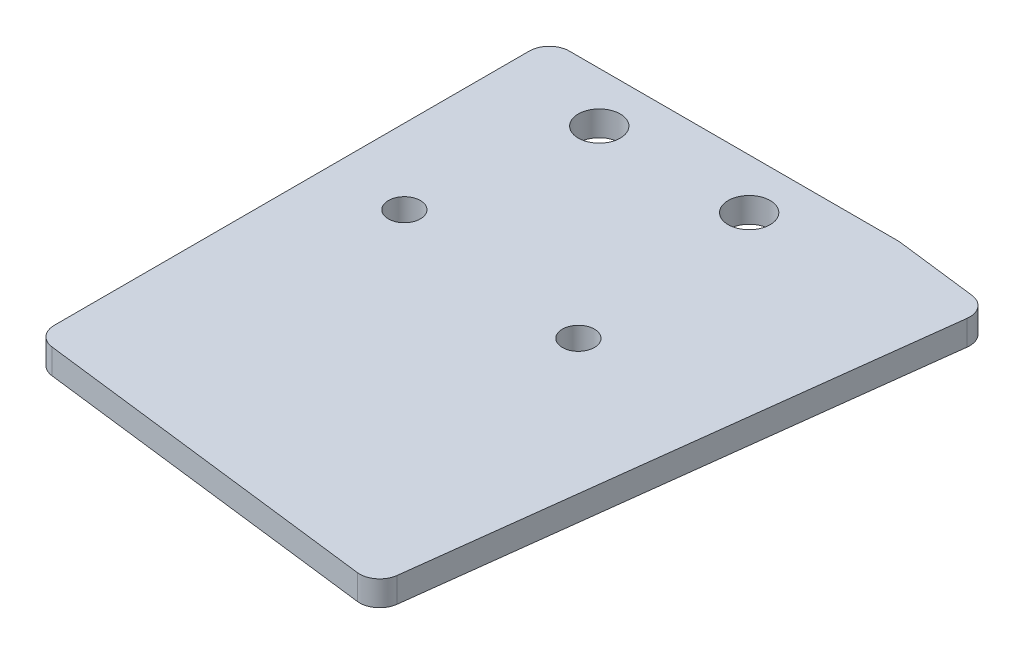
ISO-10303-21;
HEADER;
FILE_DESCRIPTION(('STEP AP214'),'2;1');
FILE_NAME('part.step','',(''),(''),'','','');
FILE_SCHEMA(('AUTOMOTIVE_DESIGN { 1 0 10303 214 1 1 1 1 }'));
ENDSEC;
DATA;
#1=APPLICATION_CONTEXT('core data for automotive mechanical design processes');
#2=APPLICATION_PROTOCOL_DEFINITION('international standard','automotive_design',2000,#1);
#3=PRODUCT_CONTEXT('',#1,'mechanical');
#4=PRODUCT('Part','Part','',(#3));
#5=PRODUCT_RELATED_PRODUCT_CATEGORY('part','',(#4));
#6=PRODUCT_DEFINITION_FORMATION('','',#4);
#7=PRODUCT_DEFINITION_CONTEXT('part definition',#1,'design');
#8=PRODUCT_DEFINITION('design','',#6,#7);
#9=PRODUCT_DEFINITION_SHAPE('','',#8);
#10=(LENGTH_UNIT() NAMED_UNIT(*) SI_UNIT(.MILLI.,.METRE.));
#11=(NAMED_UNIT(*) PLANE_ANGLE_UNIT() SI_UNIT($,.RADIAN.));
#12=(NAMED_UNIT(*) SI_UNIT($,.STERADIAN.) SOLID_ANGLE_UNIT());
#13=UNCERTAINTY_MEASURE_WITH_UNIT(LENGTH_MEASURE(1.E-05),#10,'distance_accuracy_value','');
#14=(GEOMETRIC_REPRESENTATION_CONTEXT(3) GLOBAL_UNCERTAINTY_ASSIGNED_CONTEXT((#13)) GLOBAL_UNIT_ASSIGNED_CONTEXT((#10,
#11,#12)) REPRESENTATION_CONTEXT('',''));
#15=CARTESIAN_POINT('',(0.,0.,0.));
#16=DIRECTION('',(0.,0.,1.));
#17=DIRECTION('',(1.,0.,0.));
#18=AXIS2_PLACEMENT_3D('',#15,#16,#17);
#19=CARTESIAN_POINT('',(0.,2.5,0.));
#20=DIRECTION('',(0.,1.,0.));
#21=DIRECTION('',(0.,0.,1.));
#22=AXIS2_PLACEMENT_3D('',#19,#20,#21);
#23=PLANE('',#22);
#24=CARTESIAN_POINT('',(-7.5,2.5,0.));
#25=DIRECTION('',(0.,1.,0.));
#26=DIRECTION('',(0.,0.,1.));
#27=AXIS2_PLACEMENT_3D('',#24,#25,#26);
#28=CIRCLE('',#27,2.1);
#29=CARTESIAN_POINT('',(-7.5,2.5,2.1));
#30=VERTEX_POINT('',#29);
#31=EDGE_CURVE('E147',#30,#30,#28,.T.);
#32=ORIENTED_EDGE('',*,*,#31,.F.);
#33=EDGE_LOOP('',(#32));
#34=FACE_BOUND('',#33,.T.);
#35=DIRECTION('',(-1.,0.,0.));
#36=VECTOR('',#35,1.);
#37=CARTESIAN_POINT('',(-17.5,2.5,-5.));
#38=LINE('',#37,#36);
#39=CARTESIAN_POINT('',(17.377674759699,2.5,-5.));
#40=VERTEX_POINT('',#39);
#41=CARTESIAN_POINT('',(-15.5,2.5,-5.));
#42=VERTEX_POINT('',#41);
#43=EDGE_CURVE('E142',#40,#42,#38,.T.);
#44=ORIENTED_EDGE('',*,*,#43,.T.);
#45=CARTESIAN_POINT('',(-15.5,2.5,-3.));
#46=DIRECTION('',(0.,1.,0.));
#47=DIRECTION('',(0.,0.,1.));
#48=AXIS2_PLACEMENT_3D('',#45,#46,#47);
#49=CIRCLE('',#48,2.);
#50=CARTESIAN_POINT('',(-17.5,2.5,-3.));
#51=VERTEX_POINT('',#50);
#52=EDGE_CURVE('E168',#42,#51,#49,.T.);
#53=ORIENTED_EDGE('',*,*,#52,.T.);
#54=DIRECTION('',(0.,0.,1.));
#55=VECTOR('',#54,1.);
#56=CARTESIAN_POINT('',(-17.5,2.5,-5.));
#57=LINE('',#56,#55);
#58=CARTESIAN_POINT('',(-17.5,2.5,44.5349600278818));
#59=VERTEX_POINT('',#58);
#60=EDGE_CURVE('E134',#51,#59,#57,.T.);
#61=ORIENTED_EDGE('',*,*,#60,.T.);
#62=CARTESIAN_POINT('',(-15.5,2.5,44.5349600278818));
#63=DIRECTION('',(0.,1.,0.));
#64=DIRECTION('',(0.,0.,1.));
#65=AXIS2_PLACEMENT_3D('',#62,#63,#64);
#66=CIRCLE('',#65,2.);
#67=CARTESIAN_POINT('',(-15.7437386868103,2.5,46.5200523311644));
#68=VERTEX_POINT('',#67);
#69=EDGE_CURVE('E166',#59,#68,#66,.T.);
#70=ORIENTED_EDGE('',*,*,#69,.T.);
#71=DIRECTION('',(0.992546151641323,0.,0.121869343405144));
#72=VECTOR('',#71,1.);
#73=CARTESIAN_POINT('',(17.5,2.5,50.6018701885952));
#74=LINE('',#73,#72);
#75=CARTESIAN_POINT('',(19.0979427020093,2.5,50.7980728816094));
#76=VERTEX_POINT('',#75);
#77=EDGE_CURVE('E210',#68,#76,#74,.T.);
#78=ORIENTED_EDGE('',*,*,#77,.T.);
#79=CARTESIAN_POINT('',(19.3416813888196,2.5,48.8129805783268));
#80=DIRECTION('',(0.,1.,0.));
#81=DIRECTION('',(0.,0.,1.));
#82=AXIS2_PLACEMENT_3D('',#79,#80,#81);
#83=CIRCLE('',#82,2.);
#84=CARTESIAN_POINT('',(21.3267736921022,2.5,49.0567192651371));
#85=VERTEX_POINT('',#84);
#86=EDGE_CURVE('E164',#76,#85,#83,.T.);
#87=ORIENTED_EDGE('',*,*,#86,.T.);
#88=DIRECTION('',(0.121869343405145,0.,-0.992546151641322));
#89=VECTOR('',#88,1.);
#90=CARTESIAN_POINT('',(21.0830350052919,2.5,51.0418115684197));
#91=LINE('',#90,#89);
#92=CARTESIAN_POINT('',(27.5649512359373,2.5,-1.74915973106862));
#93=VERTEX_POINT('',#92);
#94=EDGE_CURVE('E194',#85,#93,#91,.T.);
#95=ORIENTED_EDGE('',*,*,#94,.T.);
#96=CARTESIAN_POINT('',(25.5798589326546,2.5,-1.99289841787892));
#97=DIRECTION('',(0.,1.,0.));
#98=DIRECTION('',(0.,0.,1.));
#99=AXIS2_PLACEMENT_3D('',#96,#97,#98);
#100=CIRCLE('',#99,2.);
#101=CARTESIAN_POINT('',(25.8235976194649,2.5,-3.97799072116156));
#102=VERTEX_POINT('',#101);
#103=EDGE_CURVE('E57',#93,#102,#100,.T.);
#104=ORIENTED_EDGE('',*,*,#103,.T.);
#105=DIRECTION('',(-0.992546151641322,0.,-0.121869343405144));
#106=VECTOR('',#105,1.);
#107=CARTESIAN_POINT('',(27.8086899227476,2.5,-3.73425203435127));
#108=LINE('',#107,#106);
#109=CARTESIAN_POINT('',(17.6214134465093,2.5,-4.98509230328265));
#110=VERTEX_POINT('',#109);
#111=EDGE_CURVE('E183',#102,#110,#108,.T.);
#112=ORIENTED_EDGE('',*,*,#111,.T.);
#113=CARTESIAN_POINT('',(17.377674759699,2.5,-3.));
#114=DIRECTION('',(0.,1.,0.));
#115=DIRECTION('',(0.,0.,1.));
#116=AXIS2_PLACEMENT_3D('',#113,#114,#115);
#117=CIRCLE('',#116,2.);
#118=EDGE_CURVE('E162',#110,#40,#117,.T.);
#119=ORIENTED_EDGE('',*,*,#118,.T.);
#120=EDGE_LOOP('',(#44,#53,#61,#70,#78,#87,#95,#104,#112,#119));
#121=FACE_BOUND('',#120,.T.);
#122=CARTESIAN_POINT('',(7.5,2.5,0.));
#123=DIRECTION('',(0.,1.,0.));
#124=DIRECTION('',(0.,0.,1.));
#125=AXIS2_PLACEMENT_3D('',#122,#123,#124);
#126=CIRCLE('',#125,2.1);
#127=CARTESIAN_POINT('',(7.5,2.5,2.1));
#128=VERTEX_POINT('',#127);
#129=EDGE_CURVE('E219',#128,#128,#126,.T.);
#130=ORIENTED_EDGE('',*,*,#129,.F.);
#131=EDGE_LOOP('',(#130));
#132=FACE_BOUND('',#131,.T.);
#133=CARTESIAN_POINT('',(-10.,2.5,17.));
#134=DIRECTION('',(0.,1.,0.));
#135=DIRECTION('',(0.,0.,1.));
#136=AXIS2_PLACEMENT_3D('',#133,#134,#135);
#137=CIRCLE('',#136,1.6);
#138=CARTESIAN_POINT('',(-10.,2.5,18.6));
#139=VERTEX_POINT('',#138);
#140=EDGE_CURVE('E202',#139,#139,#137,.T.);
#141=ORIENTED_EDGE('',*,*,#140,.F.);
#142=EDGE_LOOP('',(#141));
#143=FACE_BOUND('',#142,.T.);
#144=CARTESIAN_POINT('',(9.85092303282645,2.5,19.4373868681029));
#145=DIRECTION('',(0.,1.,0.));
#146=DIRECTION('',(0.,0.,1.));
#147=AXIS2_PLACEMENT_3D('',#144,#145,#146);
#148=CIRCLE('',#147,1.6);
#149=CARTESIAN_POINT('',(9.85092303282645,2.5,21.0373868681029));
#150=VERTEX_POINT('',#149);
#151=EDGE_CURVE('E213',#150,#150,#148,.T.);
#152=ORIENTED_EDGE('',*,*,#151,.F.);
#153=EDGE_LOOP('',(#152));
#154=FACE_BOUND('',#153,.T.);
#155=ADVANCED_FACE('F37',(#34,#121,#132,#143,#154),#23,.T.);
#156=CARTESIAN_POINT('',(0.,0.,0.));
#157=DIRECTION('',(0.,1.,0.));
#158=DIRECTION('',(0.,0.,1.));
#159=AXIS2_PLACEMENT_3D('',#156,#157,#158);
#160=PLANE('',#159);
#161=DIRECTION('',(0.,0.,1.));
#162=VECTOR('',#161,1.);
#163=CARTESIAN_POINT('',(-17.5,0.,-5.));
#164=LINE('',#163,#162);
#165=CARTESIAN_POINT('',(-17.5,0.,-3.));
#166=VERTEX_POINT('',#165);
#167=CARTESIAN_POINT('',(-17.5,0.,44.5349600278818));
#168=VERTEX_POINT('',#167);
#169=EDGE_CURVE('E131',#166,#168,#164,.T.);
#170=ORIENTED_EDGE('',*,*,#169,.F.);
#171=CARTESIAN_POINT('',(-15.5,0.,-3.));
#172=DIRECTION('',(0.,1.,0.));
#173=DIRECTION('',(0.,0.,1.));
#174=AXIS2_PLACEMENT_3D('',#171,#172,#173);
#175=CIRCLE('',#174,2.);
#176=CARTESIAN_POINT('',(-15.5,0.,-5.));
#177=VERTEX_POINT('',#176);
#178=EDGE_CURVE('E113',#166,#177,#175,.F.);
#179=ORIENTED_EDGE('',*,*,#178,.T.);
#180=DIRECTION('',(-1.,0.,0.));
#181=VECTOR('',#180,1.);
#182=CARTESIAN_POINT('',(-17.5,0.,-5.));
#183=LINE('',#182,#181);
#184=CARTESIAN_POINT('',(17.377674759699,0.,-5.));
#185=VERTEX_POINT('',#184);
#186=EDGE_CURVE('E143',#185,#177,#183,.T.);
#187=ORIENTED_EDGE('',*,*,#186,.F.);
#188=CARTESIAN_POINT('',(17.377674759699,0.,-3.));
#189=DIRECTION('',(0.,1.,0.));
#190=DIRECTION('',(0.,0.,1.));
#191=AXIS2_PLACEMENT_3D('',#188,#189,#190);
#192=CIRCLE('',#191,2.);
#193=CARTESIAN_POINT('',(17.6214134465093,0.,-4.98509230328265));
#194=VERTEX_POINT('',#193);
#195=EDGE_CURVE('E153',#185,#194,#192,.F.);
#196=ORIENTED_EDGE('',*,*,#195,.T.);
#197=DIRECTION('',(0.992546151641323,0.,0.121869343405144));
#198=VECTOR('',#197,1.);
#199=CARTESIAN_POINT('',(27.8086899227476,0.,-3.73425203435127));
#200=LINE('',#199,#198);
#201=CARTESIAN_POINT('',(25.8235976194649,0.,-3.97799072116156));
#202=VERTEX_POINT('',#201);
#203=EDGE_CURVE('E182',#194,#202,#200,.T.);
#204=ORIENTED_EDGE('',*,*,#203,.T.);
#205=CARTESIAN_POINT('',(25.5798589326546,0.,-1.99289841787892));
#206=DIRECTION('',(0.,1.,0.));
#207=DIRECTION('',(0.,0.,1.));
#208=AXIS2_PLACEMENT_3D('',#205,#206,#207);
#209=CIRCLE('',#208,2.);
#210=CARTESIAN_POINT('',(27.5649512359373,0.,-1.74915973106864));
#211=VERTEX_POINT('',#210);
#212=EDGE_CURVE('E135',#202,#211,#209,.F.);
#213=ORIENTED_EDGE('',*,*,#212,.T.);
#214=DIRECTION('',(-0.121869343405145,0.,0.992546151641323));
#215=VECTOR('',#214,1.);
#216=CARTESIAN_POINT('',(21.0830350052919,0.,51.0418115684197));
#217=LINE('',#216,#215);
#218=CARTESIAN_POINT('',(21.3267736921022,0.,49.0567192651371));
#219=VERTEX_POINT('',#218);
#220=EDGE_CURVE('E188',#211,#219,#217,.T.);
#221=ORIENTED_EDGE('',*,*,#220,.T.);
#222=CARTESIAN_POINT('',(19.3416813888196,0.,48.8129805783268));
#223=DIRECTION('',(0.,1.,0.));
#224=DIRECTION('',(0.,0.,1.));
#225=AXIS2_PLACEMENT_3D('',#222,#223,#224);
#226=CIRCLE('',#225,2.);
#227=CARTESIAN_POINT('',(19.0979427020093,0.,50.7980728816094));
#228=VERTEX_POINT('',#227);
#229=EDGE_CURVE('E155',#219,#228,#226,.F.);
#230=ORIENTED_EDGE('',*,*,#229,.T.);
#231=DIRECTION('',(-0.992546151641323,0.,-0.121869343405144));
#232=VECTOR('',#231,1.);
#233=CARTESIAN_POINT('',(17.5,0.,50.6018701885952));
#234=LINE('',#233,#232);
#235=CARTESIAN_POINT('',(-15.7437386868103,0.,46.5200523311644));
#236=VERTEX_POINT('',#235);
#237=EDGE_CURVE('E208',#228,#236,#234,.T.);
#238=ORIENTED_EDGE('',*,*,#237,.T.);
#239=CARTESIAN_POINT('',(-15.5,0.,44.5349600278818));
#240=DIRECTION('',(0.,1.,0.));
#241=DIRECTION('',(0.,0.,1.));
#242=AXIS2_PLACEMENT_3D('',#239,#240,#241);
#243=CIRCLE('',#242,2.);
#244=EDGE_CURVE('E124',#236,#168,#243,.F.);
#245=ORIENTED_EDGE('',*,*,#244,.T.);
#246=EDGE_LOOP('',(#170,#179,#187,#196,#204,#213,#221,#230,#238,#245));
#247=FACE_BOUND('',#246,.T.);
#248=CARTESIAN_POINT('',(-7.5,0.,0.));
#249=DIRECTION('',(0.,1.,0.));
#250=DIRECTION('',(0.,0.,1.));
#251=AXIS2_PLACEMENT_3D('',#248,#249,#250);
#252=CIRCLE('',#251,2.1);
#253=CARTESIAN_POINT('',(-7.5,0.,2.1));
#254=VERTEX_POINT('',#253);
#255=EDGE_CURVE('E222',#254,#254,#252,.T.);
#256=ORIENTED_EDGE('',*,*,#255,.T.);
#257=EDGE_LOOP('',(#256));
#258=FACE_BOUND('',#257,.T.);
#259=CARTESIAN_POINT('',(7.5,0.,0.));
#260=DIRECTION('',(0.,1.,0.));
#261=DIRECTION('',(0.,0.,1.));
#262=AXIS2_PLACEMENT_3D('',#259,#260,#261);
#263=CIRCLE('',#262,2.1);
#264=CARTESIAN_POINT('',(7.5,0.,2.1));
#265=VERTEX_POINT('',#264);
#266=EDGE_CURVE('E206',#265,#265,#263,.T.);
#267=ORIENTED_EDGE('',*,*,#266,.T.);
#268=EDGE_LOOP('',(#267));
#269=FACE_BOUND('',#268,.T.);
#270=CARTESIAN_POINT('',(-10.,0.,17.));
#271=DIRECTION('',(0.,1.,0.));
#272=DIRECTION('',(0.,0.,1.));
#273=AXIS2_PLACEMENT_3D('',#270,#271,#272);
#274=CIRCLE('',#273,1.6);
#275=CARTESIAN_POINT('',(-10.,0.,18.6));
#276=VERTEX_POINT('',#275);
#277=EDGE_CURVE('E207',#276,#276,#274,.F.);
#278=ORIENTED_EDGE('',*,*,#277,.F.);
#279=EDGE_LOOP('',(#278));
#280=FACE_BOUND('',#279,.T.);
#281=CARTESIAN_POINT('',(9.85092303282645,0.,19.4373868681029));
#282=DIRECTION('',(0.,1.,0.));
#283=DIRECTION('',(0.,0.,1.));
#284=AXIS2_PLACEMENT_3D('',#281,#282,#283);
#285=CIRCLE('',#284,1.6);
#286=CARTESIAN_POINT('',(9.85092303282645,0.,21.0373868681029));
#287=VERTEX_POINT('',#286);
#288=EDGE_CURVE('E203',#287,#287,#285,.F.);
#289=ORIENTED_EDGE('',*,*,#288,.F.);
#290=EDGE_LOOP('',(#289));
#291=FACE_BOUND('',#290,.T.);
#292=ADVANCED_FACE('F138',(#247,#258,#269,#280,#291),#160,.F.);
#293=CARTESIAN_POINT('',(-17.5,2.5,-5.));
#294=DIRECTION('',(0.,0.,1.));
#295=DIRECTION('',(1.,0.,0.));
#296=AXIS2_PLACEMENT_3D('',#293,#294,#295);
#297=PLANE('',#296);
#298=ORIENTED_EDGE('',*,*,#186,.T.);
#299=DIRECTION('',(0.,-1.,0.));
#300=VECTOR('',#299,1.);
#301=CARTESIAN_POINT('',(-15.5,2.5,-5.));
#302=LINE('',#301,#300);
#303=EDGE_CURVE('E118',#177,#42,#302,.F.);
#304=ORIENTED_EDGE('',*,*,#303,.T.);
#305=ORIENTED_EDGE('',*,*,#43,.F.);
#306=DIRECTION('',(0.,-1.,0.));
#307=VECTOR('',#306,1.);
#308=CARTESIAN_POINT('',(17.377674759699,0.,-5.));
#309=LINE('',#308,#307);
#310=EDGE_CURVE('E123',#40,#185,#309,.T.);
#311=ORIENTED_EDGE('',*,*,#310,.T.);
#312=EDGE_LOOP('',(#298,#304,#305,#311));
#313=FACE_BOUND('',#312,.T.);
#314=ADVANCED_FACE('F233',(#313),#297,.F.);
#315=CARTESIAN_POINT('',(-17.5,2.5,-5.));
#316=DIRECTION('',(1.,0.,0.));
#317=DIRECTION('',(0.,0.,-1.));
#318=AXIS2_PLACEMENT_3D('',#315,#316,#317);
#319=PLANE('',#318);
#320=ORIENTED_EDGE('',*,*,#60,.F.);
#321=DIRECTION('',(0.,-1.,0.));
#322=VECTOR('',#321,1.);
#323=CARTESIAN_POINT('',(-17.5,2.5,-3.));
#324=LINE('',#323,#322);
#325=EDGE_CURVE('E117',#51,#166,#324,.T.);
#326=ORIENTED_EDGE('',*,*,#325,.T.);
#327=ORIENTED_EDGE('',*,*,#169,.T.);
#328=DIRECTION('',(0.,1.,0.));
#329=VECTOR('',#328,1.);
#330=CARTESIAN_POINT('',(-17.5,2.5,44.5349600278818));
#331=LINE('',#330,#329);
#332=EDGE_CURVE('E136',#168,#59,#331,.T.);
#333=ORIENTED_EDGE('',*,*,#332,.T.);
#334=EDGE_LOOP('',(#320,#326,#327,#333));
#335=FACE_BOUND('',#334,.T.);
#336=ADVANCED_FACE('F129',(#335),#319,.F.);
#337=CARTESIAN_POINT('',(-7.5,2.5,0.));
#338=DIRECTION('',(0.,-1.,0.));
#339=DIRECTION('',(0.,0.,-1.));
#340=AXIS2_PLACEMENT_3D('',#337,#338,#339);
#341=CYLINDRICAL_SURFACE('',#340,2.1);
#342=ORIENTED_EDGE('',*,*,#31,.T.);
#343=EDGE_LOOP('',(#342));
#344=FACE_BOUND('',#343,.T.);
#345=ORIENTED_EDGE('',*,*,#255,.F.);
#346=EDGE_LOOP('',(#345));
#347=FACE_BOUND('',#346,.T.);
#348=ADVANCED_FACE('F255',(#344,#347),#341,.F.);
#349=CARTESIAN_POINT('',(7.5,2.5,0.));
#350=DIRECTION('',(0.,-1.,0.));
#351=DIRECTION('',(0.,0.,-1.));
#352=AXIS2_PLACEMENT_3D('',#349,#350,#351);
#353=CYLINDRICAL_SURFACE('',#352,2.1);
#354=ORIENTED_EDGE('',*,*,#129,.T.);
#355=EDGE_LOOP('',(#354));
#356=FACE_BOUND('',#355,.T.);
#357=ORIENTED_EDGE('',*,*,#266,.F.);
#358=EDGE_LOOP('',(#357));
#359=FACE_BOUND('',#358,.T.);
#360=ADVANCED_FACE('F276',(#356,#359),#353,.F.);
#361=CARTESIAN_POINT('',(17.5,-57.4850464442492,50.6018701885952));
#362=DIRECTION('',(-0.121869343405144,0.,0.992546151641323));
#363=DIRECTION('',(0.992546151641323,0.,0.121869343405144));
#364=AXIS2_PLACEMENT_3D('',#361,#362,#363);
#365=PLANE('',#364);
#366=ORIENTED_EDGE('',*,*,#77,.F.);
#367=DIRECTION('',(0.,1.,0.));
#368=VECTOR('',#367,1.);
#369=CARTESIAN_POINT('',(-15.7437386868103,0.,46.5200523311644));
#370=LINE('',#369,#368);
#371=EDGE_CURVE('E173',#68,#236,#370,.F.);
#372=ORIENTED_EDGE('',*,*,#371,.T.);
#373=ORIENTED_EDGE('',*,*,#237,.F.);
#374=DIRECTION('',(0.,1.,0.));
#375=VECTOR('',#374,1.);
#376=CARTESIAN_POINT('',(19.0979427020093,-57.4850464442492,50.7980728816094));
#377=LINE('',#376,#375);
#378=EDGE_CURVE('E170',#228,#76,#377,.T.);
#379=ORIENTED_EDGE('',*,*,#378,.T.);
#380=EDGE_LOOP('',(#366,#372,#373,#379));
#381=FACE_BOUND('',#380,.T.);
#382=ADVANCED_FACE('F271',(#381),#365,.T.);
#383=CARTESIAN_POINT('',(9.85092303282645,-57.4850464442492,19.4373868681029));
#384=DIRECTION('',(0.,1.,0.));
#385=DIRECTION('',(0.,0.,1.));
#386=AXIS2_PLACEMENT_3D('',#383,#384,#385);
#387=CYLINDRICAL_SURFACE('',#386,1.6);
#388=CARTESIAN_POINT('',(9.85092303282645,0.,21.0373868681029));
#389=CARTESIAN_POINT('',(9.85092303282645,0.0260416666666591,21.0373868681029));
#390=CARTESIAN_POINT('',(9.85092303282645,0.0520833333333253,21.0373868681029));
#391=CARTESIAN_POINT('',(9.85092303282645,0.104166666666658,21.0373868681029));
#392=CARTESIAN_POINT('',(9.85092303282645,0.130208333333324,21.0373868681029));
#393=CARTESIAN_POINT('',(9.85092303282645,0.182291666666658,21.0373868681029));
#394=CARTESIAN_POINT('',(9.85092303282645,0.208333333333327,21.0373868681029));
#395=CARTESIAN_POINT('',(9.85092303282645,0.260416666666661,21.0373868681029));
#396=CARTESIAN_POINT('',(9.85092303282645,0.286458333333327,21.0373868681029));
#397=CARTESIAN_POINT('',(9.85092303282645,0.338541666666659,21.0373868681029));
#398=CARTESIAN_POINT('',(9.85092303282645,0.364583333333326,21.0373868681029));
#399=CARTESIAN_POINT('',(9.85092303282645,0.41666666666666,21.0373868681029));
#400=CARTESIAN_POINT('',(9.85092303282645,0.442708333333329,21.0373868681029));
#401=CARTESIAN_POINT('',(9.85092303282645,0.494791666666663,21.0373868681029));
#402=CARTESIAN_POINT('',(9.85092303282645,0.520833333333329,21.0373868681029));
#403=CARTESIAN_POINT('',(9.85092303282645,0.572916666666661,21.0373868681029));
#404=CARTESIAN_POINT('',(9.85092303282645,0.598958333333327,21.0373868681029));
#405=CARTESIAN_POINT('',(9.85092303282645,0.65104166666666,21.0373868681029));
#406=CARTESIAN_POINT('',(9.85092303282645,0.677083333333326,21.0373868681029));
#407=CARTESIAN_POINT('',(9.85092303282645,0.729166666666658,21.0373868681029));
#408=CARTESIAN_POINT('',(9.85092303282645,0.755208333333324,21.0373868681029));
#409=CARTESIAN_POINT('',(9.85092303282645,0.807291666666659,21.0373868681029));
#410=CARTESIAN_POINT('',(9.85092303282645,0.833333333333327,21.0373868681029));
#411=CARTESIAN_POINT('',(9.85092303282645,0.885416666666662,21.0373868681029));
#412=CARTESIAN_POINT('',(9.85092303282645,0.911458333333328,21.0373868681029));
#413=CARTESIAN_POINT('',(9.85092303282645,0.96354166666666,21.0373868681029));
#414=CARTESIAN_POINT('',(9.85092303282645,0.989583333333326,21.0373868681029));
#415=CARTESIAN_POINT('',(9.85092303282645,1.04166666666666,21.0373868681029));
#416=CARTESIAN_POINT('',(9.85092303282645,1.06770833333333,21.0373868681029));
#417=CARTESIAN_POINT('',(9.85092303282645,1.11979166666666,21.0373868681029));
#418=CARTESIAN_POINT('',(9.85092303282645,1.14583333333333,21.0373868681029));
#419=CARTESIAN_POINT('',(9.85092303282645,1.19791666666666,21.0373868681029));
#420=CARTESIAN_POINT('',(9.85092303282645,1.22395833333333,21.0373868681029));
#421=CARTESIAN_POINT('',(9.85092303282645,1.27604166666666,21.0373868681029));
#422=CARTESIAN_POINT('',(9.85092303282645,1.30208333333333,21.0373868681029));
#423=CARTESIAN_POINT('',(9.85092303282645,1.35416666666666,21.0373868681029));
#424=CARTESIAN_POINT('',(9.85092303282645,1.38020833333332,21.0373868681029));
#425=CARTESIAN_POINT('',(9.85092303282645,1.43229166666666,21.0373868681029));
#426=CARTESIAN_POINT('',(9.85092303282645,1.45833333333333,21.0373868681029));
#427=CARTESIAN_POINT('',(9.85092303282645,1.51041666666666,21.0373868681029));
#428=CARTESIAN_POINT('',(9.85092303282645,1.53645833333333,21.0373868681029));
#429=CARTESIAN_POINT('',(9.85092303282645,1.58854166666666,21.0373868681029));
#430=CARTESIAN_POINT('',(9.85092303282645,1.61458333333333,21.0373868681029));
#431=CARTESIAN_POINT('',(9.85092303282645,1.66666666666666,21.0373868681029));
#432=CARTESIAN_POINT('',(9.85092303282645,1.69270833333333,21.0373868681029));
#433=CARTESIAN_POINT('',(9.85092303282645,1.74479166666666,21.0373868681029));
#434=CARTESIAN_POINT('',(9.85092303282645,1.77083333333333,21.0373868681029));
#435=CARTESIAN_POINT('',(9.85092303282645,1.82291666666666,21.0373868681029));
#436=CARTESIAN_POINT('',(9.85092303282645,1.84895833333333,21.0373868681029));
#437=CARTESIAN_POINT('',(9.85092303282645,1.90104166666666,21.0373868681029));
#438=CARTESIAN_POINT('',(9.85092303282645,1.92708333333333,21.0373868681029));
#439=CARTESIAN_POINT('',(9.85092303282645,1.97916666666666,21.0373868681029));
#440=CARTESIAN_POINT('',(9.85092303282645,2.00520833333333,21.0373868681029));
#441=CARTESIAN_POINT('',(9.85092303282645,2.05729166666666,21.0373868681029));
#442=CARTESIAN_POINT('',(9.85092303282645,2.08333333333333,21.0373868681029));
#443=CARTESIAN_POINT('',(9.85092303282645,2.13541666666666,21.0373868681029));
#444=CARTESIAN_POINT('',(9.85092303282645,2.16145833333333,21.0373868681029));
#445=CARTESIAN_POINT('',(9.85092303282645,2.21354166666666,21.0373868681029));
#446=CARTESIAN_POINT('',(9.85092303282645,2.23958333333333,21.0373868681029));
#447=CARTESIAN_POINT('',(9.85092303282645,2.29166666666666,21.0373868681029));
#448=CARTESIAN_POINT('',(9.85092303282645,2.31770833333333,21.0373868681029));
#449=CARTESIAN_POINT('',(9.85092303282645,2.36979166666666,21.0373868681029));
#450=CARTESIAN_POINT('',(9.85092303282645,2.39583333333333,21.0373868681029));
#451=CARTESIAN_POINT('',(9.85092303282645,2.44791666666666,21.0373868681029));
#452=CARTESIAN_POINT('',(9.85092303282645,2.47395833333333,21.0373868681029));
#453=CARTESIAN_POINT('',(9.85092303282645,2.5,21.0373868681029));
#454=B_SPLINE_CURVE_WITH_KNOTS('',3,(#388,#389,#390,#391,#392,#393,#394,#395,#396,#397,#398,
#399,#400,#401,#402,#403,#404,#405,#406,#407,#408,#409,#410,#411,#412,#413,#414,#415,#416,#417,
#418,#419,#420,#421,#422,#423,#424,#425,#426,#427,#428,#429,#430,#431,#432,#433,#434,#435,#436,
#437,#438,#439,#440,#441,#442,#443,#444,#445,#446,#447,#448,#449,#450,#451,#452,#453),
.UNSPECIFIED.,.F.,.F.,(4,2,2,2,2,2,2,2,2,2,2,2,2,2,2,2,2,2,2,2,2,2,2,2,2,2,2,2,2,2,2,2,4),(0.,
0.0781249999999983,0.156249999999997,0.234375000000002,0.3125,0.390624999999999,
0.468750000000004,0.546875000000002,0.625000000000001,0.703124999999999,0.781249999999997,
0.859375000000002,0.937500000000001,1.015625,1.09375,1.171875,1.25,1.328125,1.40625,1.484375,
1.5625,1.640625,1.71875,1.796875,1.875,1.953125,2.03125,2.109375,2.1875,2.265625,
2.34375000000001,2.421875,2.5),.UNSPECIFIED.);
#455=EDGE_CURVE('BSEAM275',#287,#150,#454,.T.);
#456=ORIENTED_EDGE('',*,*,#288,.T.);
#457=ORIENTED_EDGE('',*,*,#151,.T.);
#458=ORIENTED_EDGE('',*,*,#455,.T.);
#459=ORIENTED_EDGE('',*,*,#455,.F.);
#460=EDGE_LOOP('',(#456,#458,#457,#459));
#461=FACE_BOUND('',#460,.T.);
#462=ADVANCED_FACE('F275',(#461),#387,.F.);
#463=CARTESIAN_POINT('',(-10.,-57.4850464442492,17.));
#464=DIRECTION('',(0.,1.,0.));
#465=DIRECTION('',(0.,0.,1.));
#466=AXIS2_PLACEMENT_3D('',#463,#464,#465);
#467=CYLINDRICAL_SURFACE('',#466,1.6);
#468=CARTESIAN_POINT('',(-10.,0.,18.6));
#469=CARTESIAN_POINT('',(-10.,0.0260416666666591,18.6));
#470=CARTESIAN_POINT('',(-10.,0.0520833333333253,18.6));
#471=CARTESIAN_POINT('',(-10.,0.104166666666658,18.6));
#472=CARTESIAN_POINT('',(-10.,0.130208333333324,18.6));
#473=CARTESIAN_POINT('',(-10.,0.182291666666658,18.6));
#474=CARTESIAN_POINT('',(-10.,0.208333333333327,18.6));
#475=CARTESIAN_POINT('',(-10.,0.260416666666661,18.6));
#476=CARTESIAN_POINT('',(-10.,0.286458333333327,18.6));
#477=CARTESIAN_POINT('',(-10.,0.338541666666659,18.6));
#478=CARTESIAN_POINT('',(-10.,0.364583333333326,18.6));
#479=CARTESIAN_POINT('',(-10.,0.41666666666666,18.6));
#480=CARTESIAN_POINT('',(-10.,0.442708333333329,18.6));
#481=CARTESIAN_POINT('',(-10.,0.494791666666663,18.6));
#482=CARTESIAN_POINT('',(-10.,0.520833333333329,18.6));
#483=CARTESIAN_POINT('',(-10.,0.572916666666661,18.6));
#484=CARTESIAN_POINT('',(-10.,0.598958333333327,18.6));
#485=CARTESIAN_POINT('',(-10.,0.65104166666666,18.6));
#486=CARTESIAN_POINT('',(-10.,0.677083333333326,18.6));
#487=CARTESIAN_POINT('',(-10.,0.729166666666658,18.6));
#488=CARTESIAN_POINT('',(-10.,0.755208333333324,18.6));
#489=CARTESIAN_POINT('',(-10.,0.807291666666659,18.6));
#490=CARTESIAN_POINT('',(-10.,0.833333333333327,18.6));
#491=CARTESIAN_POINT('',(-10.,0.885416666666662,18.6));
#492=CARTESIAN_POINT('',(-10.,0.911458333333328,18.6));
#493=CARTESIAN_POINT('',(-10.,0.96354166666666,18.6));
#494=CARTESIAN_POINT('',(-10.,0.989583333333326,18.6));
#495=CARTESIAN_POINT('',(-10.,1.04166666666666,18.6));
#496=CARTESIAN_POINT('',(-10.,1.06770833333333,18.6));
#497=CARTESIAN_POINT('',(-10.,1.11979166666666,18.6));
#498=CARTESIAN_POINT('',(-10.,1.14583333333333,18.6));
#499=CARTESIAN_POINT('',(-10.,1.19791666666666,18.6));
#500=CARTESIAN_POINT('',(-10.,1.22395833333333,18.6));
#501=CARTESIAN_POINT('',(-10.,1.27604166666666,18.6));
#502=CARTESIAN_POINT('',(-10.,1.30208333333333,18.6));
#503=CARTESIAN_POINT('',(-10.,1.35416666666666,18.6));
#504=CARTESIAN_POINT('',(-10.,1.38020833333332,18.6));
#505=CARTESIAN_POINT('',(-10.,1.43229166666666,18.6));
#506=CARTESIAN_POINT('',(-10.,1.45833333333333,18.6));
#507=CARTESIAN_POINT('',(-10.,1.51041666666666,18.6));
#508=CARTESIAN_POINT('',(-10.,1.53645833333333,18.6));
#509=CARTESIAN_POINT('',(-10.,1.58854166666666,18.6));
#510=CARTESIAN_POINT('',(-10.,1.61458333333333,18.6));
#511=CARTESIAN_POINT('',(-10.,1.66666666666666,18.6));
#512=CARTESIAN_POINT('',(-10.,1.69270833333333,18.6));
#513=CARTESIAN_POINT('',(-10.,1.74479166666666,18.6));
#514=CARTESIAN_POINT('',(-10.,1.77083333333333,18.6));
#515=CARTESIAN_POINT('',(-10.,1.82291666666666,18.6));
#516=CARTESIAN_POINT('',(-10.,1.84895833333333,18.6));
#517=CARTESIAN_POINT('',(-10.,1.90104166666666,18.6));
#518=CARTESIAN_POINT('',(-10.,1.92708333333333,18.6));
#519=CARTESIAN_POINT('',(-10.,1.97916666666666,18.6));
#520=CARTESIAN_POINT('',(-10.,2.00520833333333,18.6));
#521=CARTESIAN_POINT('',(-10.,2.05729166666666,18.6));
#522=CARTESIAN_POINT('',(-10.,2.08333333333333,18.6));
#523=CARTESIAN_POINT('',(-10.,2.13541666666666,18.6));
#524=CARTESIAN_POINT('',(-10.,2.16145833333333,18.6));
#525=CARTESIAN_POINT('',(-10.,2.21354166666666,18.6));
#526=CARTESIAN_POINT('',(-10.,2.23958333333333,18.6));
#527=CARTESIAN_POINT('',(-10.,2.29166666666666,18.6));
#528=CARTESIAN_POINT('',(-10.,2.31770833333333,18.6));
#529=CARTESIAN_POINT('',(-10.,2.36979166666666,18.6));
#530=CARTESIAN_POINT('',(-10.,2.39583333333333,18.6));
#531=CARTESIAN_POINT('',(-10.,2.44791666666666,18.6));
#532=CARTESIAN_POINT('',(-10.,2.47395833333333,18.6));
#533=CARTESIAN_POINT('',(-10.,2.5,18.6));
#534=B_SPLINE_CURVE_WITH_KNOTS('',3,(#468,#469,#470,#471,#472,#473,#474,#475,#476,#477,#478,
#479,#480,#481,#482,#483,#484,#485,#486,#487,#488,#489,#490,#491,#492,#493,#494,#495,#496,#497,
#498,#499,#500,#501,#502,#503,#504,#505,#506,#507,#508,#509,#510,#511,#512,#513,#514,#515,#516,
#517,#518,#519,#520,#521,#522,#523,#524,#525,#526,#527,#528,#529,#530,#531,#532,#533),
.UNSPECIFIED.,.F.,.F.,(4,2,2,2,2,2,2,2,2,2,2,2,2,2,2,2,2,2,2,2,2,2,2,2,2,2,2,2,2,2,2,2,4),(0.,
0.0781249999999983,0.156249999999997,0.234375000000002,0.3125,0.390624999999999,
0.468750000000004,0.546875000000002,0.625000000000001,0.703124999999999,0.781249999999997,
0.859375000000002,0.937500000000001,1.015625,1.09375,1.171875,1.25,1.328125,1.40625,1.484375,
1.5625,1.640625,1.71875,1.796875,1.875,1.953125,2.03125,2.109375,2.1875,2.265625,
2.34375000000001,2.421875,2.5),.UNSPECIFIED.);
#535=EDGE_CURVE('BSEAM282',#276,#139,#534,.T.);
#536=ORIENTED_EDGE('',*,*,#277,.T.);
#537=ORIENTED_EDGE('',*,*,#140,.T.);
#538=ORIENTED_EDGE('',*,*,#535,.T.);
#539=ORIENTED_EDGE('',*,*,#535,.F.);
#540=EDGE_LOOP('',(#536,#538,#537,#539));
#541=FACE_BOUND('',#540,.T.);
#542=ADVANCED_FACE('F282',(#541),#467,.F.);
#543=CARTESIAN_POINT('',(27.8086899227476,-56.9820474517511,-3.73425203435127));
#544=DIRECTION('',(0.121869343405144,0.,-0.992546151641323));
#545=DIRECTION('',(-0.992546151641323,0.,-0.121869343405144));
#546=AXIS2_PLACEMENT_3D('',#543,#544,#545);
#547=PLANE('',#546);
#548=ORIENTED_EDGE('',*,*,#203,.F.);
#549=DIRECTION('',(0.,-1.,0.));
#550=VECTOR('',#549,1.);
#551=CARTESIAN_POINT('',(17.6214134465093,2.5,-4.98509230328265));
#552=LINE('',#551,#550);
#553=EDGE_CURVE('E11',#194,#110,#552,.F.);
#554=ORIENTED_EDGE('',*,*,#553,.T.);
#555=ORIENTED_EDGE('',*,*,#111,.F.);
#556=DIRECTION('',(0.,1.,0.));
#557=VECTOR('',#556,1.);
#558=CARTESIAN_POINT('',(25.8235976194649,-56.9820474517511,-3.97799072116156));
#559=LINE('',#558,#557);
#560=EDGE_CURVE('E45',#102,#202,#559,.F.);
#561=ORIENTED_EDGE('',*,*,#560,.T.);
#562=EDGE_LOOP('',(#548,#554,#555,#561));
#563=FACE_BOUND('',#562,.T.);
#564=ADVANCED_FACE('F181',(#563),#547,.T.);
#565=CARTESIAN_POINT('',(21.0830350052919,-56.9820474517511,51.0418115684197));
#566=DIRECTION('',(0.992546151641323,0.,0.121869343405145));
#567=DIRECTION('',(0.121869343405145,0.,-0.992546151641323));
#568=AXIS2_PLACEMENT_3D('',#565,#566,#567);
#569=PLANE('',#568);
#570=ORIENTED_EDGE('',*,*,#94,.F.);
#571=DIRECTION('',(0.,1.,0.));
#572=VECTOR('',#571,1.);
#573=CARTESIAN_POINT('',(21.3267736921022,-56.9820474517511,49.0567192651371));
#574=LINE('',#573,#572);
#575=EDGE_CURVE('E178',#85,#219,#574,.F.);
#576=ORIENTED_EDGE('',*,*,#575,.T.);
#577=ORIENTED_EDGE('',*,*,#220,.F.);
#578=DIRECTION('',(0.,1.,0.));
#579=VECTOR('',#578,1.);
#580=CARTESIAN_POINT('',(27.5649512359373,-56.9820474517511,-1.74915973106863));
#581=LINE('',#580,#579);
#582=EDGE_CURVE('E175',#211,#93,#581,.T.);
#583=ORIENTED_EDGE('',*,*,#582,.T.);
#584=EDGE_LOOP('',(#570,#576,#577,#583));
#585=FACE_BOUND('',#584,.T.);
#586=ADVANCED_FACE('F193',(#585),#569,.T.);
#587=CARTESIAN_POINT('',(-15.5,2.5,-3.));
#588=DIRECTION('',(0.,-1.,0.));
#589=DIRECTION('',(0.,0.,-1.));
#590=AXIS2_PLACEMENT_3D('',#587,#588,#589);
#591=CYLINDRICAL_SURFACE('',#590,2.);
#592=ORIENTED_EDGE('',*,*,#52,.F.);
#593=ORIENTED_EDGE('',*,*,#303,.F.);
#594=ORIENTED_EDGE('',*,*,#178,.F.);
#595=ORIENTED_EDGE('',*,*,#325,.F.);
#596=EDGE_LOOP('',(#592,#593,#594,#595));
#597=FACE_BOUND('',#596,.T.);
#598=ADVANCED_FACE('F116',(#597),#591,.T.);
#599=CARTESIAN_POINT('',(-15.5,2.5,44.5349600278818));
#600=DIRECTION('',(0.,-1.,0.));
#601=DIRECTION('',(0.,0.,-1.));
#602=AXIS2_PLACEMENT_3D('',#599,#600,#601);
#603=CYLINDRICAL_SURFACE('',#602,2.);
#604=ORIENTED_EDGE('',*,*,#244,.F.);
#605=ORIENTED_EDGE('',*,*,#371,.F.);
#606=ORIENTED_EDGE('',*,*,#69,.F.);
#607=ORIENTED_EDGE('',*,*,#332,.F.);
#608=EDGE_LOOP('',(#604,#605,#606,#607));
#609=FACE_BOUND('',#608,.T.);
#610=ADVANCED_FACE('F242',(#609),#603,.T.);
#611=CARTESIAN_POINT('',(19.3416813888196,-57.4850464442492,48.8129805783268));
#612=DIRECTION('',(0.,1.,0.));
#613=DIRECTION('',(0.,0.,1.));
#614=AXIS2_PLACEMENT_3D('',#611,#612,#613);
#615=CYLINDRICAL_SURFACE('',#614,2.);
#616=ORIENTED_EDGE('',*,*,#229,.F.);
#617=ORIENTED_EDGE('',*,*,#575,.F.);
#618=ORIENTED_EDGE('',*,*,#86,.F.);
#619=ORIENTED_EDGE('',*,*,#378,.F.);
#620=EDGE_LOOP('',(#616,#617,#618,#619));
#621=FACE_BOUND('',#620,.T.);
#622=ADVANCED_FACE('F237',(#621),#615,.T.);
#623=CARTESIAN_POINT('',(17.377674759699,2.5,-3.));
#624=DIRECTION('',(0.,1.,0.));
#625=DIRECTION('',(0.,0.,1.));
#626=AXIS2_PLACEMENT_3D('',#623,#624,#625);
#627=CYLINDRICAL_SURFACE('',#626,2.);
#628=ORIENTED_EDGE('',*,*,#118,.F.);
#629=ORIENTED_EDGE('',*,*,#553,.F.);
#630=ORIENTED_EDGE('',*,*,#195,.F.);
#631=ORIENTED_EDGE('',*,*,#310,.F.);
#632=EDGE_LOOP('',(#628,#629,#630,#631));
#633=FACE_BOUND('',#632,.T.);
#634=ADVANCED_FACE('F235',(#633),#627,.T.);
#635=CARTESIAN_POINT('',(25.5798589326546,-56.9820474517511,-1.99289841787892));
#636=DIRECTION('',(0.,1.,0.));
#637=DIRECTION('',(0.,0.,1.));
#638=AXIS2_PLACEMENT_3D('',#635,#636,#637);
#639=CYLINDRICAL_SURFACE('',#638,2.);
#640=ORIENTED_EDGE('',*,*,#212,.F.);
#641=ORIENTED_EDGE('',*,*,#560,.F.);
#642=ORIENTED_EDGE('',*,*,#103,.F.);
#643=ORIENTED_EDGE('',*,*,#582,.F.);
#644=EDGE_LOOP('',(#640,#641,#642,#643));
#645=FACE_BOUND('',#644,.T.);
#646=ADVANCED_FACE('F39',(#645),#639,.T.);
#647=CLOSED_SHELL('',(#155,#292,#314,#336,#348,#360,#382,#462,#542,#564,#586,#598,#610,#622,
#634,#646));
#648=MANIFOLD_SOLID_BREP('B2',#647);
#649=ADVANCED_BREP_SHAPE_REPRESENTATION('',(#18,#648),#14);
#650=SHAPE_DEFINITION_REPRESENTATION(#9,#649);
ENDSEC;
END-ISO-10303-21;
